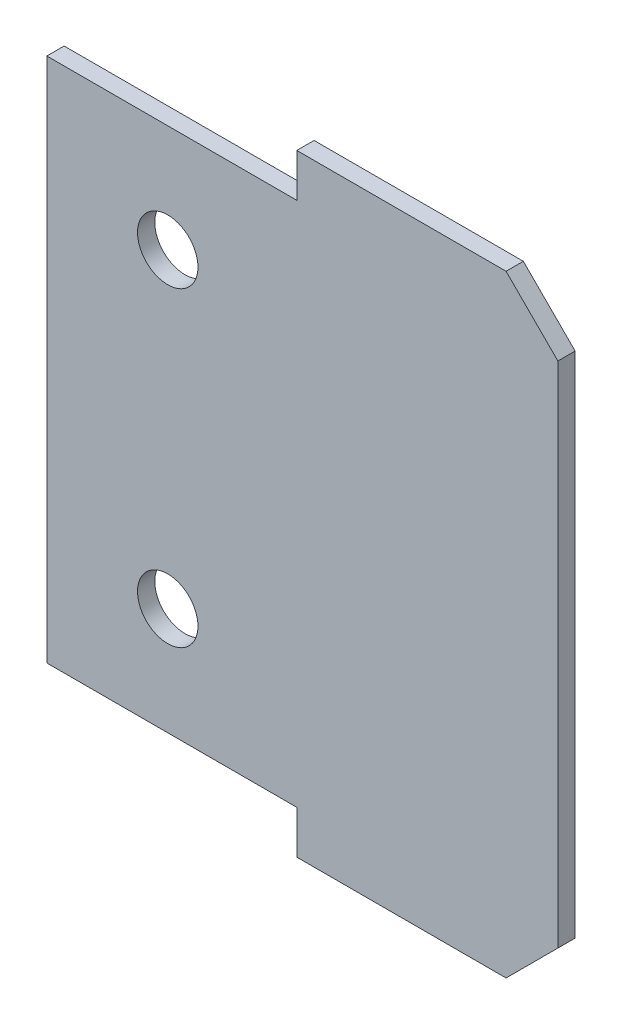
ISO-10303-21;
HEADER;
FILE_DESCRIPTION(('STEP AP214'),'2;1');
FILE_NAME('part.step','',(''),(''),'','','');
FILE_SCHEMA(('AUTOMOTIVE_DESIGN { 1 0 10303 214 1 1 1 1 }'));
ENDSEC;
DATA;
#1=APPLICATION_CONTEXT('core data for automotive mechanical design processes');
#2=APPLICATION_PROTOCOL_DEFINITION('international standard','automotive_design',2000,#1);
#3=PRODUCT_CONTEXT('',#1,'mechanical');
#4=PRODUCT('Part','Part','',(#3));
#5=PRODUCT_RELATED_PRODUCT_CATEGORY('part','',(#4));
#6=PRODUCT_DEFINITION_FORMATION('','',#4);
#7=PRODUCT_DEFINITION_CONTEXT('part definition',#1,'design');
#8=PRODUCT_DEFINITION('design','',#6,#7);
#9=PRODUCT_DEFINITION_SHAPE('','',#8);
#10=(LENGTH_UNIT() NAMED_UNIT(*) SI_UNIT(.MILLI.,.METRE.));
#11=(NAMED_UNIT(*) PLANE_ANGLE_UNIT() SI_UNIT($,.RADIAN.));
#12=(NAMED_UNIT(*) SI_UNIT($,.STERADIAN.) SOLID_ANGLE_UNIT());
#13=UNCERTAINTY_MEASURE_WITH_UNIT(LENGTH_MEASURE(1.E-05),#10,'distance_accuracy_value','');
#14=(GEOMETRIC_REPRESENTATION_CONTEXT(3) GLOBAL_UNCERTAINTY_ASSIGNED_CONTEXT((#13)) GLOBAL_UNIT_ASSIGNED_CONTEXT((#10,
#11,#12)) REPRESENTATION_CONTEXT('',''));
#15=CARTESIAN_POINT('',(0.,0.,0.));
#16=DIRECTION('',(0.,0.,1.));
#17=DIRECTION('',(1.,0.,0.));
#18=AXIS2_PLACEMENT_3D('',#15,#16,#17);
#19=CARTESIAN_POINT('',(981.209753019248,235.74060485241,6.35));
#20=DIRECTION('',(0.,0.,1.));
#21=DIRECTION('',(1.,0.,0.));
#22=AXIS2_PLACEMENT_3D('',#19,#20,#21);
#23=PLANE('',#22);
#24=CARTESIAN_POINT('',(1025.65975301925,196.24360485241,6.35));
#25=DIRECTION('',(0.,0.,1.));
#26=DIRECTION('',(1.,0.,0.));
#27=AXIS2_PLACEMENT_3D('',#24,#25,#26);
#28=CIRCLE('',#27,11.1125000000001);
#29=CARTESIAN_POINT('',(1036.77225301925,196.24360485241,6.35));
#30=VERTEX_POINT('',#29);
#31=EDGE_CURVE('E145',#30,#30,#28,.T.);
#32=ORIENTED_EDGE('',*,*,#31,.F.);
#33=EDGE_LOOP('',(#32));
#34=FACE_BOUND('',#33,.T.);
#35=DIRECTION('',(-1.,0.,0.));
#36=VECTOR('',#35,1.);
#37=CARTESIAN_POINT('',(1073.10836413036,235.740604852409,6.35));
#38=LINE('',#37,#36);
#39=CARTESIAN_POINT('',(1073.10836413036,235.740604852409,6.35));
#40=VERTEX_POINT('',#39);
#41=CARTESIAN_POINT('',(981.209753019248,235.74060485241,6.35));
#42=VERTEX_POINT('',#41);
#43=EDGE_CURVE('E160',#40,#42,#38,.T.);
#44=ORIENTED_EDGE('',*,*,#43,.T.);
#45=DIRECTION('',(0.,-1.,0.));
#46=VECTOR('',#45,1.);
#47=CARTESIAN_POINT('',(981.209753019248,235.74060485241,6.35));
#48=LINE('',#47,#46);
#49=CARTESIAN_POINT('',(981.209753019248,42.4466048524095,6.35));
#50=VERTEX_POINT('',#49);
#51=EDGE_CURVE('E98',#42,#50,#48,.T.);
#52=ORIENTED_EDGE('',*,*,#51,.T.);
#53=DIRECTION('',(1.,0.,0.));
#54=VECTOR('',#53,1.);
#55=CARTESIAN_POINT('',(981.209753019248,42.4466048524095,6.35));
#56=LINE('',#55,#54);
#57=CARTESIAN_POINT('',(1073.10836413036,42.4466048524095,6.35));
#58=VERTEX_POINT('',#57);
#59=EDGE_CURVE('E181',#50,#58,#56,.T.);
#60=ORIENTED_EDGE('',*,*,#59,.T.);
#61=DIRECTION('',(0.,-1.,0.));
#62=VECTOR('',#61,1.);
#63=CARTESIAN_POINT('',(1073.10836413036,42.4466048524095,6.35));
#64=LINE('',#63,#62);
#65=CARTESIAN_POINT('',(1073.10836413036,26.5716048524095,6.35));
#66=VERTEX_POINT('',#65);
#67=EDGE_CURVE('E200',#58,#66,#64,.T.);
#68=ORIENTED_EDGE('',*,*,#67,.T.);
#69=DIRECTION('',(1.,0.,0.));
#70=VECTOR('',#69,1.);
#71=CARTESIAN_POINT('',(1073.10836413036,26.5716048524095,6.35));
#72=LINE('',#71,#70);
#73=CARTESIAN_POINT('',(1150.05625301925,26.5716048524095,6.35));
#74=VERTEX_POINT('',#73);
#75=EDGE_CURVE('E197',#66,#74,#72,.T.);
#76=ORIENTED_EDGE('',*,*,#75,.T.);
#77=DIRECTION('',(0.707106781186548,0.707106781186547,0.));
#78=VECTOR('',#77,1.);
#79=CARTESIAN_POINT('',(1150.05625301925,26.5716048524095,6.35));
#80=LINE('',#79,#78);
#81=CARTESIAN_POINT('',(1169.10625301925,45.6216048524095,6.35));
#82=VERTEX_POINT('',#81);
#83=EDGE_CURVE('E199',#74,#82,#80,.T.);
#84=ORIENTED_EDGE('',*,*,#83,.T.);
#85=DIRECTION('',(0.,1.,0.));
#86=VECTOR('',#85,1.);
#87=CARTESIAN_POINT('',(1169.10625301925,45.6216048524095,6.35));
#88=LINE('',#87,#86);
#89=CARTESIAN_POINT('',(1169.10625301925,232.56560485241,6.35));
#90=VERTEX_POINT('',#89);
#91=EDGE_CURVE('E123',#82,#90,#88,.T.);
#92=ORIENTED_EDGE('',*,*,#91,.T.);
#93=DIRECTION('',(-0.707106781186547,0.707106781186547,0.));
#94=VECTOR('',#93,1.);
#95=CARTESIAN_POINT('',(1150.05625301925,251.61560485241,6.35));
#96=LINE('',#95,#94);
#97=CARTESIAN_POINT('',(1150.05625301925,251.61560485241,6.35));
#98=VERTEX_POINT('',#97);
#99=EDGE_CURVE('E117',#90,#98,#96,.T.);
#100=ORIENTED_EDGE('',*,*,#99,.T.);
#101=DIRECTION('',(-1.,0.,0.));
#102=VECTOR('',#101,1.);
#103=CARTESIAN_POINT('',(1150.05625301925,251.61560485241,6.35));
#104=LINE('',#103,#102);
#105=CARTESIAN_POINT('',(1073.10836413036,251.615604852409,6.35));
#106=VERTEX_POINT('',#105);
#107=EDGE_CURVE('E121',#98,#106,#104,.T.);
#108=ORIENTED_EDGE('',*,*,#107,.T.);
#109=DIRECTION('',(0.,-1.,0.));
#110=VECTOR('',#109,1.);
#111=CARTESIAN_POINT('',(1073.10836413036,251.615604852409,6.35));
#112=LINE('',#111,#110);
#113=EDGE_CURVE('E49',#106,#40,#112,.T.);
#114=ORIENTED_EDGE('',*,*,#113,.T.);
#115=EDGE_LOOP('',(#44,#52,#60,#68,#76,#84,#92,#100,#108,#114));
#116=FACE_BOUND('',#115,.T.);
#117=CARTESIAN_POINT('',(1025.65975301925,81.9436048524096,6.35));
#118=DIRECTION('',(0.,0.,1.));
#119=DIRECTION('',(1.,0.,0.));
#120=AXIS2_PLACEMENT_3D('',#117,#118,#119);
#121=CIRCLE('',#120,11.1125000000001);
#122=CARTESIAN_POINT('',(1036.77225301925,81.9436048524096,6.35));
#123=VERTEX_POINT('',#122);
#124=EDGE_CURVE('E211',#123,#123,#121,.T.);
#125=ORIENTED_EDGE('',*,*,#124,.F.);
#126=EDGE_LOOP('',(#125));
#127=FACE_BOUND('',#126,.T.);
#128=ADVANCED_FACE('F32',(#34,#116,#127),#23,.T.);
#129=CARTESIAN_POINT('',(981.209753019248,235.74060485241,0.));
#130=DIRECTION('',(0.,0.,1.));
#131=DIRECTION('',(1.,0.,0.));
#132=AXIS2_PLACEMENT_3D('',#129,#130,#131);
#133=PLANE('',#132);
#134=CARTESIAN_POINT('',(1025.65975301925,196.24360485241,0.));
#135=DIRECTION('',(0.,0.,1.));
#136=DIRECTION('',(1.,0.,0.));
#137=AXIS2_PLACEMENT_3D('',#134,#135,#136);
#138=CIRCLE('',#137,11.1125000000001);
#139=CARTESIAN_POINT('',(1036.77225301925,196.24360485241,0.));
#140=VERTEX_POINT('',#139);
#141=EDGE_CURVE('E208',#140,#140,#138,.T.);
#142=ORIENTED_EDGE('',*,*,#141,.T.);
#143=EDGE_LOOP('',(#142));
#144=FACE_BOUND('',#143,.T.);
#145=DIRECTION('',(-1.,0.,0.));
#146=VECTOR('',#145,1.);
#147=CARTESIAN_POINT('',(1073.10836413036,235.740604852409,0.));
#148=LINE('',#147,#146);
#149=CARTESIAN_POINT('',(1073.10836413036,235.740604852409,0.));
#150=VERTEX_POINT('',#149);
#151=CARTESIAN_POINT('',(981.209753019248,235.74060485241,0.));
#152=VERTEX_POINT('',#151);
#153=EDGE_CURVE('E141',#150,#152,#148,.T.);
#154=ORIENTED_EDGE('',*,*,#153,.F.);
#155=DIRECTION('',(0.,-1.,0.));
#156=VECTOR('',#155,1.);
#157=CARTESIAN_POINT('',(1073.10836413036,251.615604852409,0.));
#158=LINE('',#157,#156);
#159=CARTESIAN_POINT('',(1073.10836413036,251.615604852409,0.));
#160=VERTEX_POINT('',#159);
#161=EDGE_CURVE('E90',#160,#150,#158,.T.);
#162=ORIENTED_EDGE('',*,*,#161,.F.);
#163=DIRECTION('',(-1.,0.,0.));
#164=VECTOR('',#163,1.);
#165=CARTESIAN_POINT('',(1150.05625301925,251.61560485241,0.));
#166=LINE('',#165,#164);
#167=CARTESIAN_POINT('',(1150.05625301925,251.61560485241,0.));
#168=VERTEX_POINT('',#167);
#169=EDGE_CURVE('E84',#168,#160,#166,.T.);
#170=ORIENTED_EDGE('',*,*,#169,.F.);
#171=DIRECTION('',(-0.707106781186547,0.707106781186547,0.));
#172=VECTOR('',#171,1.);
#173=CARTESIAN_POINT('',(1150.05625301925,251.61560485241,0.));
#174=LINE('',#173,#172);
#175=CARTESIAN_POINT('',(1169.10625301925,232.56560485241,0.));
#176=VERTEX_POINT('',#175);
#177=EDGE_CURVE('E131',#176,#168,#174,.T.);
#178=ORIENTED_EDGE('',*,*,#177,.F.);
#179=DIRECTION('',(0.,1.,0.));
#180=VECTOR('',#179,1.);
#181=CARTESIAN_POINT('',(1169.10625301925,45.6216048524095,0.));
#182=LINE('',#181,#180);
#183=CARTESIAN_POINT('',(1169.10625301925,45.6216048524095,0.));
#184=VERTEX_POINT('',#183);
#185=EDGE_CURVE('E155',#184,#176,#182,.T.);
#186=ORIENTED_EDGE('',*,*,#185,.F.);
#187=DIRECTION('',(0.707106781186548,0.707106781186547,0.));
#188=VECTOR('',#187,1.);
#189=CARTESIAN_POINT('',(1150.05625301925,26.5716048524095,0.));
#190=LINE('',#189,#188);
#191=CARTESIAN_POINT('',(1150.05625301925,26.5716048524095,0.));
#192=VERTEX_POINT('',#191);
#193=EDGE_CURVE('E153',#192,#184,#190,.T.);
#194=ORIENTED_EDGE('',*,*,#193,.F.);
#195=DIRECTION('',(1.,0.,0.));
#196=VECTOR('',#195,1.);
#197=CARTESIAN_POINT('',(1073.10836413036,26.5716048524095,0.));
#198=LINE('',#197,#196);
#199=CARTESIAN_POINT('',(1073.10836413036,26.5716048524095,0.));
#200=VERTEX_POINT('',#199);
#201=EDGE_CURVE('E151',#200,#192,#198,.T.);
#202=ORIENTED_EDGE('',*,*,#201,.F.);
#203=DIRECTION('',(0.,-1.,0.));
#204=VECTOR('',#203,1.);
#205=CARTESIAN_POINT('',(1073.10836413036,42.4466048524095,0.));
#206=LINE('',#205,#204);
#207=CARTESIAN_POINT('',(1073.10836413036,42.4466048524095,0.));
#208=VERTEX_POINT('',#207);
#209=EDGE_CURVE('E149',#208,#200,#206,.T.);
#210=ORIENTED_EDGE('',*,*,#209,.F.);
#211=DIRECTION('',(1.,0.,0.));
#212=VECTOR('',#211,1.);
#213=CARTESIAN_POINT('',(981.209753019248,42.4466048524095,0.));
#214=LINE('',#213,#212);
#215=CARTESIAN_POINT('',(981.209753019248,42.4466048524095,0.));
#216=VERTEX_POINT('',#215);
#217=EDGE_CURVE('E147',#216,#208,#214,.T.);
#218=ORIENTED_EDGE('',*,*,#217,.F.);
#219=DIRECTION('',(0.,-1.,0.));
#220=VECTOR('',#219,1.);
#221=CARTESIAN_POINT('',(981.209753019248,235.74060485241,0.));
#222=LINE('',#221,#220);
#223=EDGE_CURVE('E144',#152,#216,#222,.T.);
#224=ORIENTED_EDGE('',*,*,#223,.F.);
#225=EDGE_LOOP('',(#154,#162,#170,#178,#186,#194,#202,#210,#218,#224));
#226=FACE_BOUND('',#225,.T.);
#227=CARTESIAN_POINT('',(1025.65975301925,81.9436048524096,0.));
#228=DIRECTION('',(0.,0.,1.));
#229=DIRECTION('',(1.,0.,0.));
#230=AXIS2_PLACEMENT_3D('',#227,#228,#229);
#231=CIRCLE('',#230,11.1125000000001);
#232=CARTESIAN_POINT('',(1036.77225301925,81.9436048524096,0.));
#233=VERTEX_POINT('',#232);
#234=EDGE_CURVE('E214',#233,#233,#231,.T.);
#235=ORIENTED_EDGE('',*,*,#234,.T.);
#236=EDGE_LOOP('',(#235));
#237=FACE_BOUND('',#236,.T.);
#238=ADVANCED_FACE('F185',(#144,#226,#237),#133,.F.);
#239=CARTESIAN_POINT('',(1073.10836413036,235.740604852409,6.35));
#240=DIRECTION('',(0.,-1.,0.));
#241=DIRECTION('',(1.,0.,0.));
#242=AXIS2_PLACEMENT_3D('',#239,#240,#241);
#243=PLANE('',#242);
#244=ORIENTED_EDGE('',*,*,#153,.T.);
#245=DIRECTION('',(0.,0.,-1.));
#246=VECTOR('',#245,1.);
#247=CARTESIAN_POINT('',(981.209753019248,235.74060485241,6.35));
#248=LINE('',#247,#246);
#249=EDGE_CURVE('E11',#42,#152,#248,.T.);
#250=ORIENTED_EDGE('',*,*,#249,.F.);
#251=ORIENTED_EDGE('',*,*,#43,.F.);
#252=DIRECTION('',(0.,0.,-1.));
#253=VECTOR('',#252,1.);
#254=CARTESIAN_POINT('',(1073.10836413036,235.740604852409,6.35));
#255=LINE('',#254,#253);
#256=EDGE_CURVE('E137',#40,#150,#255,.T.);
#257=ORIENTED_EDGE('',*,*,#256,.T.);
#258=EDGE_LOOP('',(#244,#250,#251,#257));
#259=FACE_BOUND('',#258,.T.);
#260=ADVANCED_FACE('F34',(#259),#243,.F.);
#261=CARTESIAN_POINT('',(981.209753019248,235.74060485241,6.35));
#262=DIRECTION('',(1.,0.,0.));
#263=DIRECTION('',(0.,0.,-1.));
#264=AXIS2_PLACEMENT_3D('',#261,#262,#263);
#265=PLANE('',#264);
#266=ORIENTED_EDGE('',*,*,#223,.T.);
#267=DIRECTION('',(0.,0.,-1.));
#268=VECTOR('',#267,1.);
#269=CARTESIAN_POINT('',(981.209753019248,42.4466048524095,6.35));
#270=LINE('',#269,#268);
#271=EDGE_CURVE('E41',#50,#216,#270,.T.);
#272=ORIENTED_EDGE('',*,*,#271,.F.);
#273=ORIENTED_EDGE('',*,*,#51,.F.);
#274=ORIENTED_EDGE('',*,*,#249,.T.);
#275=EDGE_LOOP('',(#266,#272,#273,#274));
#276=FACE_BOUND('',#275,.T.);
#277=ADVANCED_FACE('F255',(#276),#265,.F.);
#278=CARTESIAN_POINT('',(981.209753019248,42.4466048524095,6.35));
#279=DIRECTION('',(0.,1.,0.));
#280=DIRECTION('',(0.,0.,1.));
#281=AXIS2_PLACEMENT_3D('',#278,#279,#280);
#282=PLANE('',#281);
#283=ORIENTED_EDGE('',*,*,#217,.T.);
#284=DIRECTION('',(0.,0.,-1.));
#285=VECTOR('',#284,1.);
#286=CARTESIAN_POINT('',(1073.10836413036,42.4466048524095,6.35));
#287=LINE('',#286,#285);
#288=EDGE_CURVE('E173',#58,#208,#287,.T.);
#289=ORIENTED_EDGE('',*,*,#288,.F.);
#290=ORIENTED_EDGE('',*,*,#59,.F.);
#291=ORIENTED_EDGE('',*,*,#271,.T.);
#292=EDGE_LOOP('',(#283,#289,#290,#291));
#293=FACE_BOUND('',#292,.T.);
#294=ADVANCED_FACE('F179',(#293),#282,.F.);
#295=CARTESIAN_POINT('',(1073.10836413036,42.4466048524095,6.35));
#296=DIRECTION('',(1.,0.,0.));
#297=DIRECTION('',(0.,0.,-1.));
#298=AXIS2_PLACEMENT_3D('',#295,#296,#297);
#299=PLANE('',#298);
#300=ORIENTED_EDGE('',*,*,#209,.T.);
#301=DIRECTION('',(0.,0.,-1.));
#302=VECTOR('',#301,1.);
#303=CARTESIAN_POINT('',(1073.10836413036,26.5716048524095,6.35));
#304=LINE('',#303,#302);
#305=EDGE_CURVE('E170',#66,#200,#304,.T.);
#306=ORIENTED_EDGE('',*,*,#305,.F.);
#307=ORIENTED_EDGE('',*,*,#67,.F.);
#308=ORIENTED_EDGE('',*,*,#288,.T.);
#309=EDGE_LOOP('',(#300,#306,#307,#308));
#310=FACE_BOUND('',#309,.T.);
#311=ADVANCED_FACE('F191',(#310),#299,.F.);
#312=CARTESIAN_POINT('',(1073.10836413036,26.5716048524095,6.35));
#313=DIRECTION('',(0.,1.,0.));
#314=DIRECTION('',(-1.,0.,0.));
#315=AXIS2_PLACEMENT_3D('',#312,#313,#314);
#316=PLANE('',#315);
#317=ORIENTED_EDGE('',*,*,#201,.T.);
#318=DIRECTION('',(0.,0.,-1.));
#319=VECTOR('',#318,1.);
#320=CARTESIAN_POINT('',(1150.05625301925,26.5716048524095,6.35));
#321=LINE('',#320,#319);
#322=EDGE_CURVE('E167',#74,#192,#321,.T.);
#323=ORIENTED_EDGE('',*,*,#322,.F.);
#324=ORIENTED_EDGE('',*,*,#75,.F.);
#325=ORIENTED_EDGE('',*,*,#305,.T.);
#326=EDGE_LOOP('',(#317,#323,#324,#325));
#327=FACE_BOUND('',#326,.T.);
#328=ADVANCED_FACE('F195',(#327),#316,.F.);
#329=CARTESIAN_POINT('',(1150.05625301925,26.5716048524095,6.35));
#330=DIRECTION('',(-0.707106781186547,0.707106781186548,0.));
#331=DIRECTION('',(-0.707106781186548,-0.707106781186547,0.));
#332=AXIS2_PLACEMENT_3D('',#329,#330,#331);
#333=PLANE('',#332);
#334=ORIENTED_EDGE('',*,*,#193,.T.);
#335=DIRECTION('',(0.,0.,-1.));
#336=VECTOR('',#335,1.);
#337=CARTESIAN_POINT('',(1169.10625301925,45.6216048524095,6.35));
#338=LINE('',#337,#336);
#339=EDGE_CURVE('E164',#82,#184,#338,.T.);
#340=ORIENTED_EDGE('',*,*,#339,.F.);
#341=ORIENTED_EDGE('',*,*,#83,.F.);
#342=ORIENTED_EDGE('',*,*,#322,.T.);
#343=EDGE_LOOP('',(#334,#340,#341,#342));
#344=FACE_BOUND('',#343,.T.);
#345=ADVANCED_FACE('F245',(#344),#333,.F.);
#346=CARTESIAN_POINT('',(1169.10625301925,45.6216048524095,6.35));
#347=DIRECTION('',(-1.,0.,0.));
#348=DIRECTION('',(0.,0.,1.));
#349=AXIS2_PLACEMENT_3D('',#346,#347,#348);
#350=PLANE('',#349);
#351=ORIENTED_EDGE('',*,*,#185,.T.);
#352=DIRECTION('',(0.,0.,-1.));
#353=VECTOR('',#352,1.);
#354=CARTESIAN_POINT('',(1169.10625301925,232.56560485241,6.35));
#355=LINE('',#354,#353);
#356=EDGE_CURVE('E132',#90,#176,#355,.T.);
#357=ORIENTED_EDGE('',*,*,#356,.F.);
#358=ORIENTED_EDGE('',*,*,#91,.F.);
#359=ORIENTED_EDGE('',*,*,#339,.T.);
#360=EDGE_LOOP('',(#351,#357,#358,#359));
#361=FACE_BOUND('',#360,.T.);
#362=ADVANCED_FACE('F242',(#361),#350,.F.);
#363=CARTESIAN_POINT('',(1150.05625301925,251.61560485241,6.35));
#364=DIRECTION('',(-0.707106781186548,-0.707106781186548,0.));
#365=DIRECTION('',(0.707106781186548,-0.707106781186548,0.));
#366=AXIS2_PLACEMENT_3D('',#363,#364,#365);
#367=PLANE('',#366);
#368=ORIENTED_EDGE('',*,*,#177,.T.);
#369=DIRECTION('',(0.,0.,-1.));
#370=VECTOR('',#369,1.);
#371=CARTESIAN_POINT('',(1150.05625301925,251.61560485241,6.35));
#372=LINE('',#371,#370);
#373=EDGE_CURVE('E128',#98,#168,#372,.T.);
#374=ORIENTED_EDGE('',*,*,#373,.F.);
#375=ORIENTED_EDGE('',*,*,#99,.F.);
#376=ORIENTED_EDGE('',*,*,#356,.T.);
#377=EDGE_LOOP('',(#368,#374,#375,#376));
#378=FACE_BOUND('',#377,.T.);
#379=ADVANCED_FACE('F129',(#378),#367,.F.);
#380=CARTESIAN_POINT('',(1150.05625301925,251.61560485241,6.35));
#381=DIRECTION('',(0.,-1.,0.));
#382=DIRECTION('',(1.,0.,0.));
#383=AXIS2_PLACEMENT_3D('',#380,#381,#382);
#384=PLANE('',#383);
#385=ORIENTED_EDGE('',*,*,#169,.T.);
#386=DIRECTION('',(0.,0.,-1.));
#387=VECTOR('',#386,1.);
#388=CARTESIAN_POINT('',(1073.10836413036,251.615604852409,6.35));
#389=LINE('',#388,#387);
#390=EDGE_CURVE('E133',#106,#160,#389,.T.);
#391=ORIENTED_EDGE('',*,*,#390,.F.);
#392=ORIENTED_EDGE('',*,*,#107,.F.);
#393=ORIENTED_EDGE('',*,*,#373,.T.);
#394=EDGE_LOOP('',(#385,#391,#392,#393));
#395=FACE_BOUND('',#394,.T.);
#396=ADVANCED_FACE('F135',(#395),#384,.F.);
#397=CARTESIAN_POINT('',(1073.10836413036,251.615604852409,6.35));
#398=DIRECTION('',(1.,0.,0.));
#399=DIRECTION('',(0.,0.,-1.));
#400=AXIS2_PLACEMENT_3D('',#397,#398,#399);
#401=PLANE('',#400);
#402=ORIENTED_EDGE('',*,*,#161,.T.);
#403=ORIENTED_EDGE('',*,*,#256,.F.);
#404=ORIENTED_EDGE('',*,*,#113,.F.);
#405=ORIENTED_EDGE('',*,*,#390,.T.);
#406=EDGE_LOOP('',(#402,#403,#404,#405));
#407=FACE_BOUND('',#406,.T.);
#408=ADVANCED_FACE('F235',(#407),#401,.F.);
#409=CARTESIAN_POINT('',(1025.65975301925,196.24360485241,6.35));
#410=DIRECTION('',(0.,0.,-1.));
#411=DIRECTION('',(-1.,0.,0.));
#412=AXIS2_PLACEMENT_3D('',#409,#410,#411);
#413=CYLINDRICAL_SURFACE('',#412,11.1125000000001);
#414=ORIENTED_EDGE('',*,*,#31,.T.);
#415=EDGE_LOOP('',(#414));
#416=FACE_BOUND('',#415,.T.);
#417=ORIENTED_EDGE('',*,*,#141,.F.);
#418=EDGE_LOOP('',(#417));
#419=FACE_BOUND('',#418,.T.);
#420=ADVANCED_FACE('F232',(#416,#419),#413,.F.);
#421=CARTESIAN_POINT('',(1025.65975301925,81.9436048524096,6.35));
#422=DIRECTION('',(0.,0.,-1.));
#423=DIRECTION('',(-1.,0.,0.));
#424=AXIS2_PLACEMENT_3D('',#421,#422,#423);
#425=CYLINDRICAL_SURFACE('',#424,11.1125000000001);
#426=ORIENTED_EDGE('',*,*,#124,.T.);
#427=EDGE_LOOP('',(#426));
#428=FACE_BOUND('',#427,.T.);
#429=ORIENTED_EDGE('',*,*,#234,.F.);
#430=EDGE_LOOP('',(#429));
#431=FACE_BOUND('',#430,.T.);
#432=ADVANCED_FACE('F220',(#428,#431),#425,.F.);
#433=CLOSED_SHELL('',(#128,#238,#260,#277,#294,#311,#328,#345,#362,#379,#396,#408,#420,#432));
#434=MANIFOLD_SOLID_BREP('B2',#433);
#435=ADVANCED_BREP_SHAPE_REPRESENTATION('',(#18,#434),#14);
#436=SHAPE_DEFINITION_REPRESENTATION(#9,#435);
ENDSEC;
END-ISO-10303-21;
